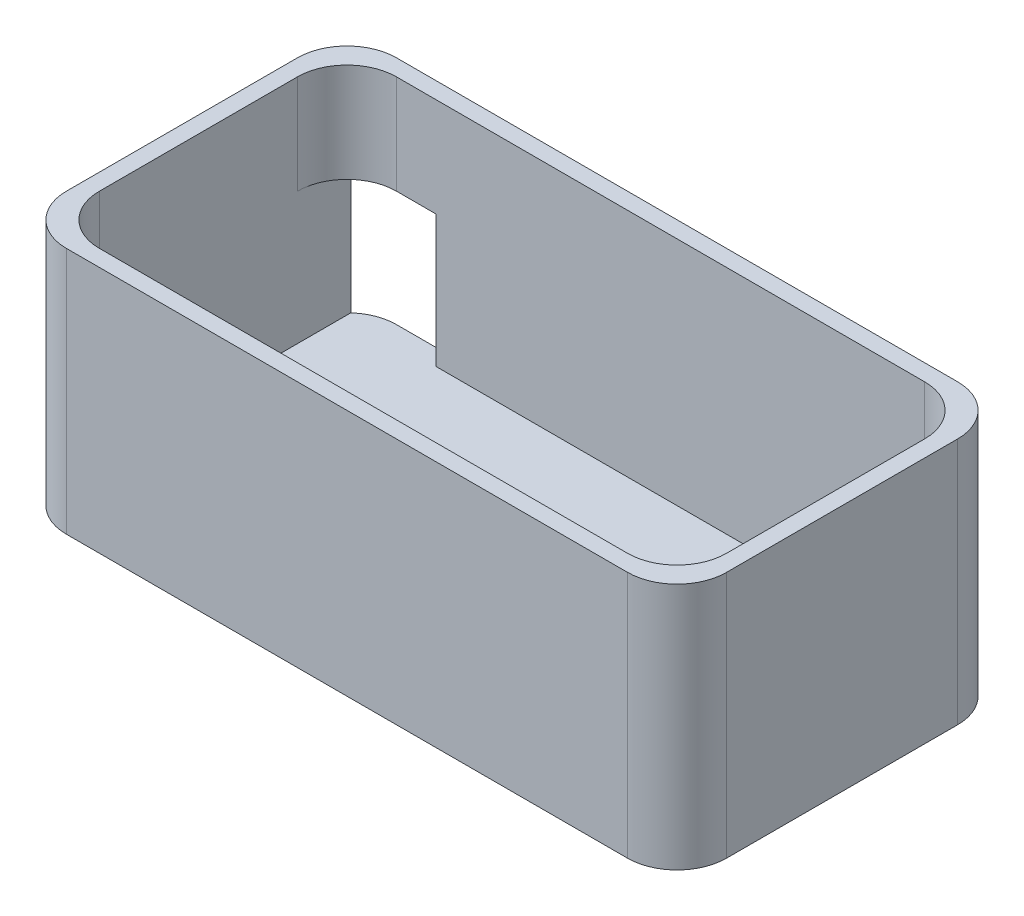
ISO-10303-21;
HEADER;
FILE_DESCRIPTION(('STEP AP214'),'2;1');
FILE_NAME('part.step','',(''),(''),'','','');
FILE_SCHEMA(('AUTOMOTIVE_DESIGN { 1 0 10303 214 1 1 1 1 }'));
ENDSEC;
DATA;
#1=APPLICATION_CONTEXT('core data for automotive mechanical design processes');
#2=APPLICATION_PROTOCOL_DEFINITION('international standard','automotive_design',2000,#1);
#3=PRODUCT_CONTEXT('',#1,'mechanical');
#4=PRODUCT('Part','Part','',(#3));
#5=PRODUCT_RELATED_PRODUCT_CATEGORY('part','',(#4));
#6=PRODUCT_DEFINITION_FORMATION('','',#4);
#7=PRODUCT_DEFINITION_CONTEXT('part definition',#1,'design');
#8=PRODUCT_DEFINITION('design','',#6,#7);
#9=PRODUCT_DEFINITION_SHAPE('','',#8);
#10=(LENGTH_UNIT() NAMED_UNIT(*) SI_UNIT(.MILLI.,.METRE.));
#11=(NAMED_UNIT(*) PLANE_ANGLE_UNIT() SI_UNIT($,.RADIAN.));
#12=(NAMED_UNIT(*) SI_UNIT($,.STERADIAN.) SOLID_ANGLE_UNIT());
#13=UNCERTAINTY_MEASURE_WITH_UNIT(LENGTH_MEASURE(1.E-05),#10,'distance_accuracy_value','');
#14=(GEOMETRIC_REPRESENTATION_CONTEXT(3) GLOBAL_UNCERTAINTY_ASSIGNED_CONTEXT((#13)) GLOBAL_UNIT_ASSIGNED_CONTEXT((#10,
#11,#12)) REPRESENTATION_CONTEXT('',''));
#15=CARTESIAN_POINT('',(0.,0.,0.));
#16=DIRECTION('',(0.,0.,1.));
#17=DIRECTION('',(1.,0.,0.));
#18=AXIS2_PLACEMENT_3D('',#15,#16,#17);
#19=CARTESIAN_POINT('',(100.,5.,-50.));
#20=DIRECTION('',(-1.,0.,0.));
#21=DIRECTION('',(0.,0.,1.));
#22=AXIS2_PLACEMENT_3D('',#19,#20,#21);
#23=PLANE('',#22);
#24=DIRECTION('',(0.,0.,-1.));
#25=VECTOR('',#24,1.);
#26=CARTESIAN_POINT('',(100.,0.,-50.));
#27=LINE('',#26,#25);
#28=CARTESIAN_POINT('',(100.,0.,35.));
#29=VERTEX_POINT('',#28);
#30=CARTESIAN_POINT('',(100.,0.,-35.));
#31=VERTEX_POINT('',#30);
#32=EDGE_CURVE('E271',#29,#31,#27,.T.);
#33=ORIENTED_EDGE('',*,*,#32,.T.);
#34=DIRECTION('',(0.,-1.,0.));
#35=VECTOR('',#34,1.);
#36=CARTESIAN_POINT('',(100.,5.,-35.));
#37=LINE('',#36,#35);
#38=CARTESIAN_POINT('',(100.,75.,-35.));
#39=VERTEX_POINT('',#38);
#40=EDGE_CURVE('E346',#31,#39,#37,.F.);
#41=ORIENTED_EDGE('',*,*,#40,.T.);
#42=DIRECTION('',(0.,0.,-1.));
#43=VECTOR('',#42,1.);
#44=CARTESIAN_POINT('',(100.,75.,-50.));
#45=LINE('',#44,#43);
#46=CARTESIAN_POINT('',(100.,75.,35.));
#47=VERTEX_POINT('',#46);
#48=EDGE_CURVE('E242',#47,#39,#45,.T.);
#49=ORIENTED_EDGE('',*,*,#48,.F.);
#50=DIRECTION('',(0.,-1.,0.));
#51=VECTOR('',#50,1.);
#52=CARTESIAN_POINT('',(100.,5.,35.));
#53=LINE('',#52,#51);
#54=EDGE_CURVE('E342',#47,#29,#53,.T.);
#55=ORIENTED_EDGE('',*,*,#54,.T.);
#56=EDGE_LOOP('',(#33,#41,#49,#55));
#57=FACE_BOUND('',#56,.T.);
#58=ADVANCED_FACE('F46',(#57),#23,.F.);
#59=CARTESIAN_POINT('',(-100.,5.,-50.));
#60=DIRECTION('',(0.,0.,1.));
#61=DIRECTION('',(1.,0.,0.));
#62=AXIS2_PLACEMENT_3D('',#59,#60,#61);
#63=PLANE('',#62);
#64=DIRECTION('',(-1.,0.,0.));
#65=VECTOR('',#64,1.);
#66=CARTESIAN_POINT('',(-100.,75.,-50.));
#67=LINE('',#66,#65);
#68=CARTESIAN_POINT('',(85.,75.,-50.));
#69=VERTEX_POINT('',#68);
#70=CARTESIAN_POINT('',(-85.,75.,-50.));
#71=VERTEX_POINT('',#70);
#72=EDGE_CURVE('E259',#69,#71,#67,.T.);
#73=ORIENTED_EDGE('',*,*,#72,.F.);
#74=DIRECTION('',(0.,-1.,0.));
#75=VECTOR('',#74,1.);
#76=CARTESIAN_POINT('',(85.,5.,-50.));
#77=LINE('',#76,#75);
#78=CARTESIAN_POINT('',(85.,0.,-50.));
#79=VERTEX_POINT('',#78);
#80=EDGE_CURVE('E326',#69,#79,#77,.T.);
#81=ORIENTED_EDGE('',*,*,#80,.T.);
#82=DIRECTION('',(-1.,0.,0.));
#83=VECTOR('',#82,1.);
#84=CARTESIAN_POINT('',(-100.,0.,-50.));
#85=LINE('',#84,#83);
#86=CARTESIAN_POINT('',(-85.,0.,-50.));
#87=VERTEX_POINT('',#86);
#88=EDGE_CURVE('E275',#79,#87,#85,.T.);
#89=ORIENTED_EDGE('',*,*,#88,.T.);
#90=DIRECTION('',(0.,-1.,0.));
#91=VECTOR('',#90,1.);
#92=CARTESIAN_POINT('',(-85.,5.,-50.));
#93=LINE('',#92,#91);
#94=CARTESIAN_POINT('',(-85.,5.,-50.));
#95=VERTEX_POINT('',#94);
#96=EDGE_CURVE('E323',#87,#95,#93,.F.);
#97=ORIENTED_EDGE('',*,*,#96,.T.);
#98=DIRECTION('',(1.,0.,0.));
#99=VECTOR('',#98,1.);
#100=CARTESIAN_POINT('',(-95.,5.,-50.));
#101=LINE('',#100,#99);
#102=CARTESIAN_POINT('',(-68.,5.,-50.));
#103=VERTEX_POINT('',#102);
#104=EDGE_CURVE('E209',#95,#103,#101,.T.);
#105=ORIENTED_EDGE('',*,*,#104,.T.);
#106=DIRECTION('',(0.,1.,0.));
#107=VECTOR('',#106,1.);
#108=CARTESIAN_POINT('',(-68.,5.,-50.));
#109=LINE('',#108,#107);
#110=CARTESIAN_POINT('',(-68.,45.,-50.));
#111=VERTEX_POINT('',#110);
#112=EDGE_CURVE('E187',#103,#111,#109,.T.);
#113=ORIENTED_EDGE('',*,*,#112,.T.);
#114=DIRECTION('',(-1.,0.,0.));
#115=VECTOR('',#114,1.);
#116=CARTESIAN_POINT('',(-95.,45.,-50.));
#117=LINE('',#116,#115);
#118=CARTESIAN_POINT('',(-85.,45.,-50.));
#119=VERTEX_POINT('',#118);
#120=EDGE_CURVE('E198',#111,#119,#117,.T.);
#121=ORIENTED_EDGE('',*,*,#120,.T.);
#122=DIRECTION('',(0.,-1.,0.));
#123=VECTOR('',#122,1.);
#124=CARTESIAN_POINT('',(-85.,5.,-50.));
#125=LINE('',#124,#123);
#126=EDGE_CURVE('E320',#119,#71,#125,.F.);
#127=ORIENTED_EDGE('',*,*,#126,.T.);
#128=EDGE_LOOP('',(#73,#81,#89,#97,#105,#113,#121,#127));
#129=FACE_BOUND('',#128,.T.);
#130=ADVANCED_FACE('F207',(#129),#63,.F.);
#131=CARTESIAN_POINT('',(-100.,5.,-50.));
#132=DIRECTION('',(1.,0.,0.));
#133=DIRECTION('',(0.,0.,-1.));
#134=AXIS2_PLACEMENT_3D('',#131,#132,#133);
#135=PLANE('',#134);
#136=DIRECTION('',(0.,0.,1.));
#137=VECTOR('',#136,1.);
#138=CARTESIAN_POINT('',(-100.,75.,-50.));
#139=LINE('',#138,#137);
#140=CARTESIAN_POINT('',(-100.,75.,-35.));
#141=VERTEX_POINT('',#140);
#142=CARTESIAN_POINT('',(-100.,75.,35.));
#143=VERTEX_POINT('',#142);
#144=EDGE_CURVE('E263',#141,#143,#139,.T.);
#145=ORIENTED_EDGE('',*,*,#144,.F.);
#146=DIRECTION('',(0.,-1.,0.));
#147=VECTOR('',#146,1.);
#148=CARTESIAN_POINT('',(-100.,5.,-35.));
#149=LINE('',#148,#147);
#150=CARTESIAN_POINT('',(-100.,0.,-35.));
#151=VERTEX_POINT('',#150);
#152=EDGE_CURVE('E364',#141,#151,#149,.T.);
#153=ORIENTED_EDGE('',*,*,#152,.T.);
#154=DIRECTION('',(0.,0.,1.));
#155=VECTOR('',#154,1.);
#156=CARTESIAN_POINT('',(-100.,0.,-50.));
#157=LINE('',#156,#155);
#158=CARTESIAN_POINT('',(-100.,0.,35.));
#159=VERTEX_POINT('',#158);
#160=EDGE_CURVE('E279',#151,#159,#157,.T.);
#161=ORIENTED_EDGE('',*,*,#160,.T.);
#162=DIRECTION('',(0.,-1.,0.));
#163=VECTOR('',#162,1.);
#164=CARTESIAN_POINT('',(-100.,5.,35.));
#165=LINE('',#164,#163);
#166=EDGE_CURVE('E361',#159,#143,#165,.F.);
#167=ORIENTED_EDGE('',*,*,#166,.T.);
#168=EDGE_LOOP('',(#145,#153,#161,#167));
#169=FACE_BOUND('',#168,.T.);
#170=ADVANCED_FACE('F453',(#169),#135,.F.);
#171=CARTESIAN_POINT('',(-100.,5.,50.));
#172=DIRECTION('',(0.,0.,-1.));
#173=DIRECTION('',(-1.,0.,0.));
#174=AXIS2_PLACEMENT_3D('',#171,#172,#173);
#175=PLANE('',#174);
#176=DIRECTION('',(1.,0.,0.));
#177=VECTOR('',#176,1.);
#178=CARTESIAN_POINT('',(-100.,0.,50.));
#179=LINE('',#178,#177);
#180=CARTESIAN_POINT('',(-85.,0.,50.));
#181=VERTEX_POINT('',#180);
#182=CARTESIAN_POINT('',(85.,0.,50.));
#183=VERTEX_POINT('',#182);
#184=EDGE_CURVE('E283',#181,#183,#179,.T.);
#185=ORIENTED_EDGE('',*,*,#184,.T.);
#186=DIRECTION('',(0.,-1.,0.));
#187=VECTOR('',#186,1.);
#188=CARTESIAN_POINT('',(85.,5.,50.));
#189=LINE('',#188,#187);
#190=CARTESIAN_POINT('',(85.,75.,50.));
#191=VERTEX_POINT('',#190);
#192=EDGE_CURVE('E383',#183,#191,#189,.F.);
#193=ORIENTED_EDGE('',*,*,#192,.T.);
#194=DIRECTION('',(1.,0.,0.));
#195=VECTOR('',#194,1.);
#196=CARTESIAN_POINT('',(-100.,75.,50.));
#197=LINE('',#196,#195);
#198=CARTESIAN_POINT('',(-85.,75.,50.));
#199=VERTEX_POINT('',#198);
#200=EDGE_CURVE('E267',#199,#191,#197,.T.);
#201=ORIENTED_EDGE('',*,*,#200,.F.);
#202=DIRECTION('',(0.,-1.,0.));
#203=VECTOR('',#202,1.);
#204=CARTESIAN_POINT('',(-85.,5.,50.));
#205=LINE('',#204,#203);
#206=EDGE_CURVE('E379',#199,#181,#205,.T.);
#207=ORIENTED_EDGE('',*,*,#206,.T.);
#208=EDGE_LOOP('',(#185,#193,#201,#207));
#209=FACE_BOUND('',#208,.T.);
#210=ADVANCED_FACE('F461',(#209),#175,.F.);
#211=CARTESIAN_POINT('',(0.,0.,0.));
#212=DIRECTION('',(0.,1.,0.));
#213=DIRECTION('',(0.,0.,1.));
#214=AXIS2_PLACEMENT_3D('',#211,#212,#213);
#215=PLANE('',#214);
#216=ORIENTED_EDGE('',*,*,#88,.F.);
#217=CARTESIAN_POINT('',(85.,0.,-35.));
#218=DIRECTION('',(0.,1.,0.));
#219=DIRECTION('',(0.,0.,1.));
#220=AXIS2_PLACEMENT_3D('',#217,#218,#219);
#221=CIRCLE('',#220,15.);
#222=EDGE_CURVE('E339',#79,#31,#221,.F.);
#223=ORIENTED_EDGE('',*,*,#222,.T.);
#224=ORIENTED_EDGE('',*,*,#32,.F.);
#225=CARTESIAN_POINT('',(85.,0.,35.));
#226=DIRECTION('',(0.,1.,0.));
#227=DIRECTION('',(0.,0.,1.));
#228=AXIS2_PLACEMENT_3D('',#225,#226,#227);
#229=CIRCLE('',#228,15.);
#230=EDGE_CURVE('E333',#29,#183,#229,.F.);
#231=ORIENTED_EDGE('',*,*,#230,.T.);
#232=ORIENTED_EDGE('',*,*,#184,.F.);
#233=CARTESIAN_POINT('',(-85.,0.,35.));
#234=DIRECTION('',(0.,1.,0.));
#235=DIRECTION('',(0.,0.,1.));
#236=AXIS2_PLACEMENT_3D('',#233,#234,#235);
#237=CIRCLE('',#236,15.);
#238=EDGE_CURVE('E330',#181,#159,#237,.F.);
#239=ORIENTED_EDGE('',*,*,#238,.T.);
#240=ORIENTED_EDGE('',*,*,#160,.F.);
#241=CARTESIAN_POINT('',(-85.,0.,-35.));
#242=DIRECTION('',(0.,1.,0.));
#243=DIRECTION('',(0.,0.,1.));
#244=AXIS2_PLACEMENT_3D('',#241,#242,#243);
#245=CIRCLE('',#244,15.);
#246=EDGE_CURVE('E336',#151,#87,#245,.F.);
#247=ORIENTED_EDGE('',*,*,#246,.T.);
#248=EDGE_LOOP('',(#216,#223,#224,#231,#232,#239,#240,#247));
#249=FACE_BOUND('',#248,.T.);
#250=ADVANCED_FACE('F449',(#249),#215,.F.);
#251=CARTESIAN_POINT('',(0.,75.,0.));
#252=DIRECTION('',(0.,1.,0.));
#253=DIRECTION('',(0.,0.,1.));
#254=AXIS2_PLACEMENT_3D('',#251,#252,#253);
#255=PLANE('',#254);
#256=ORIENTED_EDGE('',*,*,#48,.T.);
#257=CARTESIAN_POINT('',(85.,75.,-35.));
#258=DIRECTION('',(0.,1.,0.));
#259=DIRECTION('',(0.,0.,1.));
#260=AXIS2_PLACEMENT_3D('',#257,#258,#259);
#261=CIRCLE('',#260,15.);
#262=EDGE_CURVE('E358',#39,#69,#261,.T.);
#263=ORIENTED_EDGE('',*,*,#262,.T.);
#264=ORIENTED_EDGE('',*,*,#72,.T.);
#265=CARTESIAN_POINT('',(-85.,75.,-35.));
#266=DIRECTION('',(0.,1.,0.));
#267=DIRECTION('',(0.,0.,1.));
#268=AXIS2_PLACEMENT_3D('',#265,#266,#267);
#269=CIRCLE('',#268,15.);
#270=EDGE_CURVE('E355',#71,#141,#269,.T.);
#271=ORIENTED_EDGE('',*,*,#270,.T.);
#272=ORIENTED_EDGE('',*,*,#144,.T.);
#273=CARTESIAN_POINT('',(-85.,75.,35.));
#274=DIRECTION('',(0.,1.,0.));
#275=DIRECTION('',(0.,0.,1.));
#276=AXIS2_PLACEMENT_3D('',#273,#274,#275);
#277=CIRCLE('',#276,15.);
#278=EDGE_CURVE('E349',#143,#199,#277,.T.);
#279=ORIENTED_EDGE('',*,*,#278,.T.);
#280=ORIENTED_EDGE('',*,*,#200,.T.);
#281=CARTESIAN_POINT('',(85.,75.,35.));
#282=DIRECTION('',(0.,1.,0.));
#283=DIRECTION('',(0.,0.,1.));
#284=AXIS2_PLACEMENT_3D('',#281,#282,#283);
#285=CIRCLE('',#284,15.);
#286=EDGE_CURVE('E352',#191,#47,#285,.T.);
#287=ORIENTED_EDGE('',*,*,#286,.T.);
#288=EDGE_LOOP('',(#256,#263,#264,#271,#272,#279,#280,#287));
#289=FACE_BOUND('',#288,.T.);
#290=DIRECTION('',(-1.,0.,0.));
#291=VECTOR('',#290,1.);
#292=CARTESIAN_POINT('',(-95.,75.,-45.));
#293=LINE('',#292,#291);
#294=CARTESIAN_POINT('',(80.,75.,-45.));
#295=VERTEX_POINT('',#294);
#296=CARTESIAN_POINT('',(-80.,75.,-45.));
#297=VERTEX_POINT('',#296);
#298=EDGE_CURVE('E229',#295,#297,#293,.T.);
#299=ORIENTED_EDGE('',*,*,#298,.F.);
#300=CARTESIAN_POINT('',(80.,75.,-30.));
#301=DIRECTION('',(0.,1.,0.));
#302=DIRECTION('',(0.,0.,1.));
#303=AXIS2_PLACEMENT_3D('',#300,#301,#302);
#304=CIRCLE('',#303,15.);
#305=CARTESIAN_POINT('',(95.,75.,-30.));
#306=VERTEX_POINT('',#305);
#307=EDGE_CURVE('E389',#295,#306,#304,.F.);
#308=ORIENTED_EDGE('',*,*,#307,.T.);
#309=DIRECTION('',(0.,0.,-1.));
#310=VECTOR('',#309,1.);
#311=CARTESIAN_POINT('',(95.,75.,-45.));
#312=LINE('',#311,#310);
#313=CARTESIAN_POINT('',(95.,75.,30.));
#314=VERTEX_POINT('',#313);
#315=EDGE_CURVE('E225',#314,#306,#312,.T.);
#316=ORIENTED_EDGE('',*,*,#315,.F.);
#317=CARTESIAN_POINT('',(80.,75.,30.));
#318=DIRECTION('',(0.,1.,0.));
#319=DIRECTION('',(0.,0.,1.));
#320=AXIS2_PLACEMENT_3D('',#317,#318,#319);
#321=CIRCLE('',#320,15.);
#322=CARTESIAN_POINT('',(80.,75.,45.));
#323=VERTEX_POINT('',#322);
#324=EDGE_CURVE('E386',#314,#323,#321,.F.);
#325=ORIENTED_EDGE('',*,*,#324,.T.);
#326=DIRECTION('',(1.,0.,0.));
#327=VECTOR('',#326,1.);
#328=CARTESIAN_POINT('',(-95.,75.,45.));
#329=LINE('',#328,#327);
#330=CARTESIAN_POINT('',(-80.,75.,45.));
#331=VERTEX_POINT('',#330);
#332=EDGE_CURVE('E238',#331,#323,#329,.T.);
#333=ORIENTED_EDGE('',*,*,#332,.F.);
#334=CARTESIAN_POINT('',(-80.,75.,30.));
#335=DIRECTION('',(0.,1.,0.));
#336=DIRECTION('',(0.,0.,1.));
#337=AXIS2_PLACEMENT_3D('',#334,#335,#336);
#338=CIRCLE('',#337,15.);
#339=CARTESIAN_POINT('',(-95.,75.,30.));
#340=VERTEX_POINT('',#339);
#341=EDGE_CURVE('E11',#331,#340,#338,.F.);
#342=ORIENTED_EDGE('',*,*,#341,.T.);
#343=DIRECTION('',(0.,0.,1.));
#344=VECTOR('',#343,1.);
#345=CARTESIAN_POINT('',(-95.,75.,-45.));
#346=LINE('',#345,#344);
#347=CARTESIAN_POINT('',(-95.,75.,-30.));
#348=VERTEX_POINT('',#347);
#349=EDGE_CURVE('E234',#348,#340,#346,.T.);
#350=ORIENTED_EDGE('',*,*,#349,.F.);
#351=CARTESIAN_POINT('',(-80.,75.,-30.));
#352=DIRECTION('',(0.,1.,0.));
#353=DIRECTION('',(0.,0.,1.));
#354=AXIS2_PLACEMENT_3D('',#351,#352,#353);
#355=CIRCLE('',#354,15.);
#356=EDGE_CURVE('E55',#348,#297,#355,.F.);
#357=ORIENTED_EDGE('',*,*,#356,.T.);
#358=EDGE_LOOP('',(#299,#308,#316,#325,#333,#342,#350,#357));
#359=FACE_BOUND('',#358,.T.);
#360=ADVANCED_FACE('F399',(#289,#359),#255,.T.);
#361=CARTESIAN_POINT('',(95.,75.,-45.));
#362=DIRECTION('',(-1.,0.,0.));
#363=DIRECTION('',(0.,0.,1.));
#364=AXIS2_PLACEMENT_3D('',#361,#362,#363);
#365=PLANE('',#364);
#366=DIRECTION('',(0.,0.,-1.));
#367=VECTOR('',#366,1.);
#368=CARTESIAN_POINT('',(95.,5.,-45.));
#369=LINE('',#368,#367);
#370=CARTESIAN_POINT('',(95.,5.,30.));
#371=VERTEX_POINT('',#370);
#372=CARTESIAN_POINT('',(95.,5.,-30.));
#373=VERTEX_POINT('',#372);
#374=EDGE_CURVE('E221',#371,#373,#369,.T.);
#375=ORIENTED_EDGE('',*,*,#374,.F.);
#376=DIRECTION('',(0.,-1.,0.));
#377=VECTOR('',#376,1.);
#378=CARTESIAN_POINT('',(95.,75.,30.));
#379=LINE('',#378,#377);
#380=EDGE_CURVE('E310',#371,#314,#379,.F.);
#381=ORIENTED_EDGE('',*,*,#380,.T.);
#382=ORIENTED_EDGE('',*,*,#315,.T.);
#383=DIRECTION('',(0.,-1.,0.));
#384=VECTOR('',#383,1.);
#385=CARTESIAN_POINT('',(95.,5.,-30.));
#386=LINE('',#385,#384);
#387=EDGE_CURVE('E306',#306,#373,#386,.T.);
#388=ORIENTED_EDGE('',*,*,#387,.T.);
#389=EDGE_LOOP('',(#375,#381,#382,#388));
#390=FACE_BOUND('',#389,.T.);
#391=ADVANCED_FACE('F417',(#390),#365,.T.);
#392=CARTESIAN_POINT('',(-95.,75.,-45.));
#393=DIRECTION('',(0.,0.,1.));
#394=DIRECTION('',(1.,0.,0.));
#395=AXIS2_PLACEMENT_3D('',#392,#393,#394);
#396=PLANE('',#395);
#397=DIRECTION('',(-1.,0.,0.));
#398=VECTOR('',#397,1.);
#399=CARTESIAN_POINT('',(-95.,5.,-45.));
#400=LINE('',#399,#398);
#401=CARTESIAN_POINT('',(80.,5.,-45.));
#402=VERTEX_POINT('',#401);
#403=CARTESIAN_POINT('',(-68.,5.,-45.));
#404=VERTEX_POINT('',#403);
#405=EDGE_CURVE('E246',#402,#404,#400,.T.);
#406=ORIENTED_EDGE('',*,*,#405,.F.);
#407=DIRECTION('',(0.,-1.,0.));
#408=VECTOR('',#407,1.);
#409=CARTESIAN_POINT('',(80.,75.,-45.));
#410=LINE('',#409,#408);
#411=EDGE_CURVE('E317',#402,#295,#410,.F.);
#412=ORIENTED_EDGE('',*,*,#411,.T.);
#413=ORIENTED_EDGE('',*,*,#298,.T.);
#414=DIRECTION('',(0.,-1.,0.));
#415=VECTOR('',#414,1.);
#416=CARTESIAN_POINT('',(-80.,45.,-45.));
#417=LINE('',#416,#415);
#418=CARTESIAN_POINT('',(-80.,45.,-45.));
#419=VERTEX_POINT('',#418);
#420=EDGE_CURVE('E313',#297,#419,#417,.T.);
#421=ORIENTED_EDGE('',*,*,#420,.T.);
#422=DIRECTION('',(-1.,0.,0.));
#423=VECTOR('',#422,1.);
#424=CARTESIAN_POINT('',(-95.,45.,-45.));
#425=LINE('',#424,#423);
#426=CARTESIAN_POINT('',(-68.,45.,-45.));
#427=VERTEX_POINT('',#426);
#428=EDGE_CURVE('E213',#427,#419,#425,.T.);
#429=ORIENTED_EDGE('',*,*,#428,.F.);
#430=DIRECTION('',(0.,1.,0.));
#431=VECTOR('',#430,1.);
#432=CARTESIAN_POINT('',(-68.,5.,-45.));
#433=LINE('',#432,#431);
#434=EDGE_CURVE('E190',#404,#427,#433,.T.);
#435=ORIENTED_EDGE('',*,*,#434,.F.);
#436=EDGE_LOOP('',(#406,#412,#413,#421,#429,#435));
#437=FACE_BOUND('',#436,.T.);
#438=ADVANCED_FACE('F406',(#437),#396,.T.);
#439=CARTESIAN_POINT('',(-95.,75.,-45.));
#440=DIRECTION('',(1.,0.,0.));
#441=DIRECTION('',(0.,0.,-1.));
#442=AXIS2_PLACEMENT_3D('',#439,#440,#441);
#443=PLANE('',#442);
#444=DIRECTION('',(0.,0.,1.));
#445=VECTOR('',#444,1.);
#446=CARTESIAN_POINT('',(-95.,5.,-45.));
#447=LINE('',#446,#445);
#448=CARTESIAN_POINT('',(-95.,5.,-46.1803398874989));
#449=VERTEX_POINT('',#448);
#450=CARTESIAN_POINT('',(-95.,5.,30.));
#451=VERTEX_POINT('',#450);
#452=EDGE_CURVE('E249',#449,#451,#447,.T.);
#453=ORIENTED_EDGE('',*,*,#452,.F.);
#454=DIRECTION('',(0.,-1.,0.));
#455=VECTOR('',#454,1.);
#456=CARTESIAN_POINT('',(-95.,5.,-46.1803398874989));
#457=LINE('',#456,#455);
#458=CARTESIAN_POINT('',(-95.,45.,-46.1803398874989));
#459=VERTEX_POINT('',#458);
#460=EDGE_CURVE('E67',#449,#459,#457,.F.);
#461=ORIENTED_EDGE('',*,*,#460,.T.);
#462=DIRECTION('',(0.,0.,1.));
#463=VECTOR('',#462,1.);
#464=CARTESIAN_POINT('',(-95.,45.,-50.));
#465=LINE('',#464,#463);
#466=CARTESIAN_POINT('',(-95.,45.,-30.));
#467=VERTEX_POINT('',#466);
#468=EDGE_CURVE('E62',#459,#467,#465,.T.);
#469=ORIENTED_EDGE('',*,*,#468,.T.);
#470=DIRECTION('',(0.,-1.,0.));
#471=VECTOR('',#470,1.);
#472=CARTESIAN_POINT('',(-95.,75.,-30.));
#473=LINE('',#472,#471);
#474=EDGE_CURVE('E372',#467,#348,#473,.F.);
#475=ORIENTED_EDGE('',*,*,#474,.T.);
#476=ORIENTED_EDGE('',*,*,#349,.T.);
#477=DIRECTION('',(0.,-1.,0.));
#478=VECTOR('',#477,1.);
#479=CARTESIAN_POINT('',(-95.,5.,30.));
#480=LINE('',#479,#478);
#481=EDGE_CURVE('E368',#340,#451,#480,.T.);
#482=ORIENTED_EDGE('',*,*,#481,.T.);
#483=EDGE_LOOP('',(#453,#461,#469,#475,#476,#482));
#484=FACE_BOUND('',#483,.T.);
#485=ADVANCED_FACE('F431',(#484),#443,.T.);
#486=CARTESIAN_POINT('',(-95.,75.,45.));
#487=DIRECTION('',(0.,0.,-1.));
#488=DIRECTION('',(-1.,0.,0.));
#489=AXIS2_PLACEMENT_3D('',#486,#487,#488);
#490=PLANE('',#489);
#491=ORIENTED_EDGE('',*,*,#332,.T.);
#492=DIRECTION('',(0.,-1.,0.));
#493=VECTOR('',#492,1.);
#494=CARTESIAN_POINT('',(80.,5.,45.));
#495=LINE('',#494,#493);
#496=CARTESIAN_POINT('',(80.,5.,45.));
#497=VERTEX_POINT('',#496);
#498=EDGE_CURVE('E290',#323,#497,#495,.T.);
#499=ORIENTED_EDGE('',*,*,#498,.T.);
#500=DIRECTION('',(1.,0.,0.));
#501=VECTOR('',#500,1.);
#502=CARTESIAN_POINT('',(-95.,5.,45.));
#503=LINE('',#502,#501);
#504=CARTESIAN_POINT('',(-80.,5.,45.));
#505=VERTEX_POINT('',#504);
#506=EDGE_CURVE('E230',#505,#497,#503,.T.);
#507=ORIENTED_EDGE('',*,*,#506,.F.);
#508=DIRECTION('',(0.,-1.,0.));
#509=VECTOR('',#508,1.);
#510=CARTESIAN_POINT('',(-80.,75.,45.));
#511=LINE('',#510,#509);
#512=EDGE_CURVE('E287',#505,#331,#511,.F.);
#513=ORIENTED_EDGE('',*,*,#512,.T.);
#514=EDGE_LOOP('',(#491,#499,#507,#513));
#515=FACE_BOUND('',#514,.T.);
#516=ADVANCED_FACE('F425',(#515),#490,.T.);
#517=CARTESIAN_POINT('',(0.,5.,0.));
#518=DIRECTION('',(0.,1.,0.));
#519=DIRECTION('',(0.,0.,1.));
#520=AXIS2_PLACEMENT_3D('',#517,#518,#519);
#521=PLANE('',#520);
#522=ORIENTED_EDGE('',*,*,#506,.T.);
#523=CARTESIAN_POINT('',(80.,5.,30.));
#524=DIRECTION('',(0.,1.,0.));
#525=DIRECTION('',(0.,0.,1.));
#526=AXIS2_PLACEMENT_3D('',#523,#524,#525);
#527=CIRCLE('',#526,15.);
#528=EDGE_CURVE('E303',#497,#371,#527,.T.);
#529=ORIENTED_EDGE('',*,*,#528,.T.);
#530=ORIENTED_EDGE('',*,*,#374,.T.);
#531=CARTESIAN_POINT('',(80.,5.,-30.));
#532=DIRECTION('',(0.,1.,0.));
#533=DIRECTION('',(0.,0.,1.));
#534=AXIS2_PLACEMENT_3D('',#531,#532,#533);
#535=CIRCLE('',#534,15.);
#536=EDGE_CURVE('E300',#373,#402,#535,.T.);
#537=ORIENTED_EDGE('',*,*,#536,.T.);
#538=ORIENTED_EDGE('',*,*,#405,.T.);
#539=DIRECTION('',(0.,0.,1.));
#540=VECTOR('',#539,1.);
#541=CARTESIAN_POINT('',(-68.,5.,-50.));
#542=LINE('',#541,#540);
#543=EDGE_CURVE('E195',#103,#404,#542,.T.);
#544=ORIENTED_EDGE('',*,*,#543,.F.);
#545=ORIENTED_EDGE('',*,*,#104,.F.);
#546=CARTESIAN_POINT('',(-85.,5.,-35.));
#547=DIRECTION('',(0.,1.,0.));
#548=DIRECTION('',(0.,0.,1.));
#549=AXIS2_PLACEMENT_3D('',#546,#547,#548);
#550=CIRCLE('',#549,15.);
#551=EDGE_CURVE('E297',#95,#449,#550,.T.);
#552=ORIENTED_EDGE('',*,*,#551,.T.);
#553=ORIENTED_EDGE('',*,*,#452,.T.);
#554=CARTESIAN_POINT('',(-80.,5.,30.));
#555=DIRECTION('',(0.,1.,0.));
#556=DIRECTION('',(0.,0.,1.));
#557=AXIS2_PLACEMENT_3D('',#554,#555,#556);
#558=CIRCLE('',#557,15.);
#559=EDGE_CURVE('E294',#451,#505,#558,.T.);
#560=ORIENTED_EDGE('',*,*,#559,.T.);
#561=EDGE_LOOP('',(#522,#529,#530,#537,#538,#544,#545,#552,#553,#560));
#562=FACE_BOUND('',#561,.T.);
#563=ADVANCED_FACE('F432',(#562),#521,.T.);
#564=CARTESIAN_POINT('',(-95.,45.,-50.));
#565=DIRECTION('',(0.,1.,0.));
#566=DIRECTION('',(0.,0.,1.));
#567=AXIS2_PLACEMENT_3D('',#564,#565,#566);
#568=PLANE('',#567);
#569=ORIENTED_EDGE('',*,*,#468,.F.);
#570=CARTESIAN_POINT('',(-85.,45.,-35.));
#571=DIRECTION('',(0.,1.,0.));
#572=DIRECTION('',(0.,0.,1.));
#573=AXIS2_PLACEMENT_3D('',#570,#571,#572);
#574=CIRCLE('',#573,15.);
#575=EDGE_CURVE('E201',#459,#119,#574,.F.);
#576=ORIENTED_EDGE('',*,*,#575,.T.);
#577=ORIENTED_EDGE('',*,*,#120,.F.);
#578=DIRECTION('',(0.,0.,1.));
#579=VECTOR('',#578,1.);
#580=CARTESIAN_POINT('',(-68.,45.,-50.));
#581=LINE('',#580,#579);
#582=EDGE_CURVE('E182',#111,#427,#581,.T.);
#583=ORIENTED_EDGE('',*,*,#582,.T.);
#584=ORIENTED_EDGE('',*,*,#428,.T.);
#585=CARTESIAN_POINT('',(-80.,45.,-30.));
#586=DIRECTION('',(0.,1.,0.));
#587=DIRECTION('',(0.,0.,1.));
#588=AXIS2_PLACEMENT_3D('',#585,#586,#587);
#589=CIRCLE('',#588,15.);
#590=EDGE_CURVE('E392',#419,#467,#589,.T.);
#591=ORIENTED_EDGE('',*,*,#590,.T.);
#592=EDGE_LOOP('',(#569,#576,#577,#583,#584,#591));
#593=FACE_BOUND('',#592,.T.);
#594=ADVANCED_FACE('F199',(#593),#568,.F.);
#595=CARTESIAN_POINT('',(-68.,5.,-50.));
#596=DIRECTION('',(1.,0.,0.));
#597=DIRECTION('',(0.,0.,-1.));
#598=AXIS2_PLACEMENT_3D('',#595,#596,#597);
#599=PLANE('',#598);
#600=ORIENTED_EDGE('',*,*,#434,.T.);
#601=ORIENTED_EDGE('',*,*,#582,.F.);
#602=ORIENTED_EDGE('',*,*,#112,.F.);
#603=ORIENTED_EDGE('',*,*,#543,.T.);
#604=EDGE_LOOP('',(#600,#601,#602,#603));
#605=FACE_BOUND('',#604,.T.);
#606=ADVANCED_FACE('F184',(#605),#599,.F.);
#607=CARTESIAN_POINT('',(80.,75.,30.));
#608=DIRECTION('',(0.,1.,0.));
#609=DIRECTION('',(0.,0.,1.));
#610=AXIS2_PLACEMENT_3D('',#607,#608,#609);
#611=CYLINDRICAL_SURFACE('',#610,15.);
#612=ORIENTED_EDGE('',*,*,#324,.F.);
#613=ORIENTED_EDGE('',*,*,#380,.F.);
#614=ORIENTED_EDGE('',*,*,#528,.F.);
#615=ORIENTED_EDGE('',*,*,#498,.F.);
#616=EDGE_LOOP('',(#612,#613,#614,#615));
#617=FACE_BOUND('',#616,.T.);
#618=ADVANCED_FACE('F420',(#617),#611,.F.);
#619=CARTESIAN_POINT('',(80.,75.,-30.));
#620=DIRECTION('',(0.,1.,0.));
#621=DIRECTION('',(0.,0.,1.));
#622=AXIS2_PLACEMENT_3D('',#619,#620,#621);
#623=CYLINDRICAL_SURFACE('',#622,15.);
#624=ORIENTED_EDGE('',*,*,#307,.F.);
#625=ORIENTED_EDGE('',*,*,#411,.F.);
#626=ORIENTED_EDGE('',*,*,#536,.F.);
#627=ORIENTED_EDGE('',*,*,#387,.F.);
#628=EDGE_LOOP('',(#624,#625,#626,#627));
#629=FACE_BOUND('',#628,.T.);
#630=ADVANCED_FACE('F411',(#629),#623,.F.);
#631=CARTESIAN_POINT('',(85.,5.,-35.));
#632=DIRECTION('',(0.,-1.,0.));
#633=DIRECTION('',(0.,0.,-1.));
#634=AXIS2_PLACEMENT_3D('',#631,#632,#633);
#635=CYLINDRICAL_SURFACE('',#634,15.);
#636=ORIENTED_EDGE('',*,*,#262,.F.);
#637=ORIENTED_EDGE('',*,*,#40,.F.);
#638=ORIENTED_EDGE('',*,*,#222,.F.);
#639=ORIENTED_EDGE('',*,*,#80,.F.);
#640=EDGE_LOOP('',(#636,#637,#638,#639));
#641=FACE_BOUND('',#640,.T.);
#642=ADVANCED_FACE('F446',(#641),#635,.T.);
#643=CARTESIAN_POINT('',(-85.,5.,-35.));
#644=DIRECTION('',(0.,-1.,0.));
#645=DIRECTION('',(0.,0.,-1.));
#646=AXIS2_PLACEMENT_3D('',#643,#644,#645);
#647=CYLINDRICAL_SURFACE('',#646,15.);
#648=ORIENTED_EDGE('',*,*,#551,.F.);
#649=ORIENTED_EDGE('',*,*,#96,.F.);
#650=ORIENTED_EDGE('',*,*,#246,.F.);
#651=ORIENTED_EDGE('',*,*,#152,.F.);
#652=ORIENTED_EDGE('',*,*,#270,.F.);
#653=ORIENTED_EDGE('',*,*,#126,.F.);
#654=ORIENTED_EDGE('',*,*,#575,.F.);
#655=ORIENTED_EDGE('',*,*,#460,.F.);
#656=EDGE_LOOP('',(#648,#649,#650,#651,#652,#653,#654,#655));
#657=FACE_BOUND('',#656,.T.);
#658=ADVANCED_FACE('F436',(#657),#647,.T.);
#659=CARTESIAN_POINT('',(-80.,75.,-30.));
#660=DIRECTION('',(0.,1.,0.));
#661=DIRECTION('',(0.,0.,1.));
#662=AXIS2_PLACEMENT_3D('',#659,#660,#661);
#663=CYLINDRICAL_SURFACE('',#662,15.);
#664=ORIENTED_EDGE('',*,*,#356,.F.);
#665=ORIENTED_EDGE('',*,*,#474,.F.);
#666=ORIENTED_EDGE('',*,*,#590,.F.);
#667=ORIENTED_EDGE('',*,*,#420,.F.);
#668=EDGE_LOOP('',(#664,#665,#666,#667));
#669=FACE_BOUND('',#668,.T.);
#670=ADVANCED_FACE('F408',(#669),#663,.F.);
#671=CARTESIAN_POINT('',(-80.,75.,30.));
#672=DIRECTION('',(0.,1.,0.));
#673=DIRECTION('',(0.,0.,1.));
#674=AXIS2_PLACEMENT_3D('',#671,#672,#673);
#675=CYLINDRICAL_SURFACE('',#674,15.);
#676=ORIENTED_EDGE('',*,*,#341,.F.);
#677=ORIENTED_EDGE('',*,*,#512,.F.);
#678=ORIENTED_EDGE('',*,*,#559,.F.);
#679=ORIENTED_EDGE('',*,*,#481,.F.);
#680=EDGE_LOOP('',(#676,#677,#678,#679));
#681=FACE_BOUND('',#680,.T.);
#682=ADVANCED_FACE('F429',(#681),#675,.F.);
#683=CARTESIAN_POINT('',(85.,5.,35.));
#684=DIRECTION('',(0.,-1.,0.));
#685=DIRECTION('',(0.,0.,-1.));
#686=AXIS2_PLACEMENT_3D('',#683,#684,#685);
#687=CYLINDRICAL_SURFACE('',#686,15.);
#688=ORIENTED_EDGE('',*,*,#286,.F.);
#689=ORIENTED_EDGE('',*,*,#192,.F.);
#690=ORIENTED_EDGE('',*,*,#230,.F.);
#691=ORIENTED_EDGE('',*,*,#54,.F.);
#692=EDGE_LOOP('',(#688,#689,#690,#691));
#693=FACE_BOUND('',#692,.T.);
#694=ADVANCED_FACE('F466',(#693),#687,.T.);
#695=CARTESIAN_POINT('',(-85.,5.,35.));
#696=DIRECTION('',(0.,-1.,0.));
#697=DIRECTION('',(0.,0.,-1.));
#698=AXIS2_PLACEMENT_3D('',#695,#696,#697);
#699=CYLINDRICAL_SURFACE('',#698,15.);
#700=ORIENTED_EDGE('',*,*,#278,.F.);
#701=ORIENTED_EDGE('',*,*,#166,.F.);
#702=ORIENTED_EDGE('',*,*,#238,.F.);
#703=ORIENTED_EDGE('',*,*,#206,.F.);
#704=EDGE_LOOP('',(#700,#701,#702,#703));
#705=FACE_BOUND('',#704,.T.);
#706=ADVANCED_FACE('F48',(#705),#699,.T.);
#707=CLOSED_SHELL('',(#58,#130,#170,#210,#250,#360,#391,#438,#485,#516,#563,#594,#606,#618,#630,
#642,#658,#670,#682,#694,#706));
#708=MANIFOLD_SOLID_BREP('B2',#707);
#709=ADVANCED_BREP_SHAPE_REPRESENTATION('',(#18,#708),#14);
#710=SHAPE_DEFINITION_REPRESENTATION(#9,#709);
ENDSEC;
END-ISO-10303-21;
